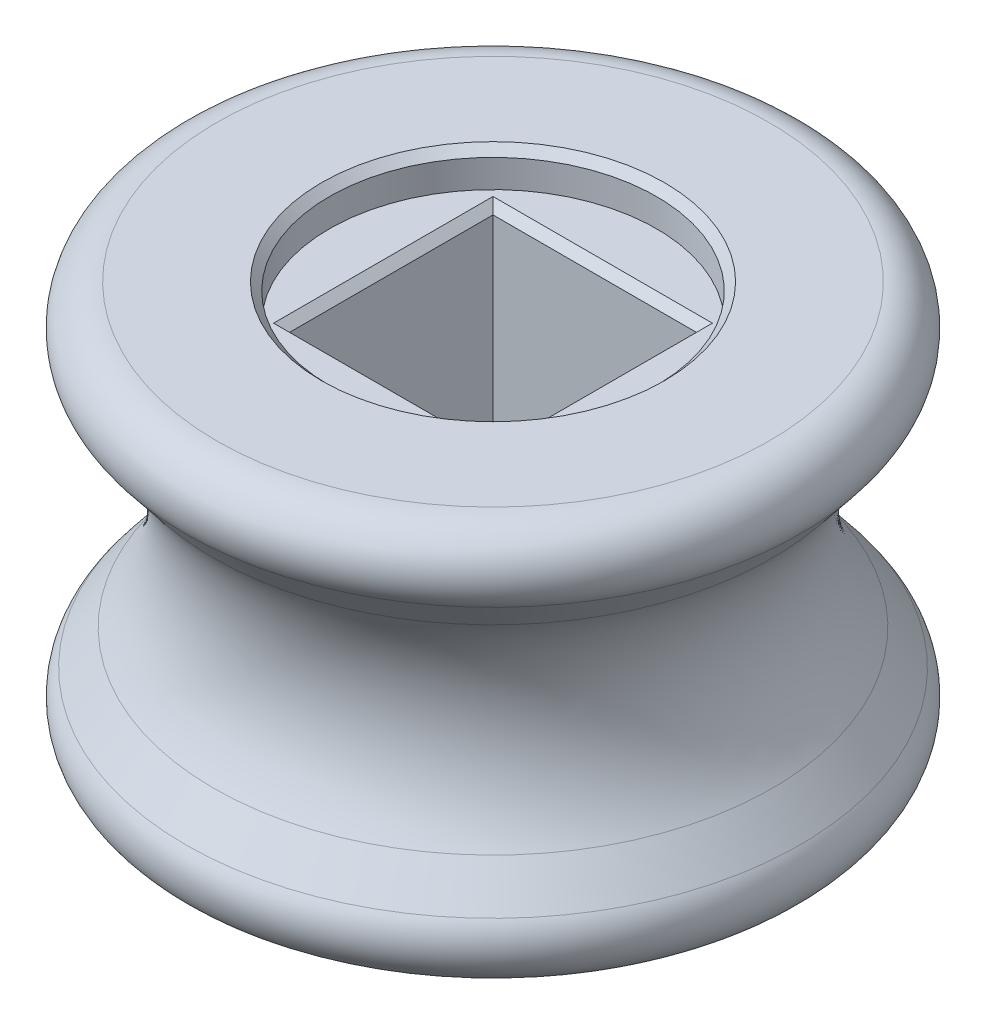
ISO-10303-21;
HEADER;
FILE_DESCRIPTION(('STEP AP214'),'2;1');
FILE_NAME('part.step','',(''),(''),'','','');
FILE_SCHEMA(('AUTOMOTIVE_DESIGN { 1 0 10303 214 1 1 1 1 }'));
ENDSEC;
DATA;
#1=APPLICATION_CONTEXT('core data for automotive mechanical design processes');
#2=APPLICATION_PROTOCOL_DEFINITION('international standard','automotive_design',2000,#1);
#3=PRODUCT_CONTEXT('',#1,'mechanical');
#4=PRODUCT('Part','Part','',(#3));
#5=PRODUCT_RELATED_PRODUCT_CATEGORY('part','',(#4));
#6=PRODUCT_DEFINITION_FORMATION('','',#4);
#7=PRODUCT_DEFINITION_CONTEXT('part definition',#1,'design');
#8=PRODUCT_DEFINITION('design','',#6,#7);
#9=PRODUCT_DEFINITION_SHAPE('','',#8);
#10=(LENGTH_UNIT() NAMED_UNIT(*) SI_UNIT(.MILLI.,.METRE.));
#11=(NAMED_UNIT(*) PLANE_ANGLE_UNIT() SI_UNIT($,.RADIAN.));
#12=(NAMED_UNIT(*) SI_UNIT($,.STERADIAN.) SOLID_ANGLE_UNIT());
#13=UNCERTAINTY_MEASURE_WITH_UNIT(LENGTH_MEASURE(1.E-05),#10,'distance_accuracy_value','');
#14=(GEOMETRIC_REPRESENTATION_CONTEXT(3) GLOBAL_UNCERTAINTY_ASSIGNED_CONTEXT((#13)) GLOBAL_UNIT_ASSIGNED_CONTEXT((#10,
#11,#12)) REPRESENTATION_CONTEXT('',''));
#15=CARTESIAN_POINT('',(0.,0.,0.));
#16=DIRECTION('',(0.,0.,1.));
#17=DIRECTION('',(1.,0.,0.));
#18=AXIS2_PLACEMENT_3D('',#15,#16,#17);
#19=CARTESIAN_POINT('',(-3.2385,26.1703841816037,3.2385));
#20=DIRECTION('',(0.,0.,-1.));
#21=DIRECTION('',(-1.,0.,0.));
#22=AXIS2_PLACEMENT_3D('',#19,#20,#21);
#23=PLANE('',#22);
#24=DIRECTION('',(0.,-1.,0.));
#25=VECTOR('',#24,1.);
#26=CARTESIAN_POINT('',(3.2385,26.1703841816037,3.2385));
#27=LINE('',#26,#25);
#28=CARTESIAN_POINT('',(3.2385,11.303,3.2385));
#29=VERTEX_POINT('',#28);
#30=CARTESIAN_POINT('',(3.2385,1.397,3.2385));
#31=VERTEX_POINT('',#30);
#32=EDGE_CURVE('E139',#29,#31,#27,.T.);
#33=ORIENTED_EDGE('',*,*,#32,.T.);
#34=DIRECTION('',(-1.,0.,0.));
#35=VECTOR('',#34,1.);
#36=CARTESIAN_POINT('',(-3.2385,1.397,3.2385));
#37=LINE('',#36,#35);
#38=CARTESIAN_POINT('',(-3.2385,1.397,3.2385));
#39=VERTEX_POINT('',#38);
#40=EDGE_CURVE('E145',#31,#39,#37,.T.);
#41=ORIENTED_EDGE('',*,*,#40,.T.);
#42=DIRECTION('',(0.,-1.,0.));
#43=VECTOR('',#42,1.);
#44=CARTESIAN_POINT('',(-3.2385,26.1703841816037,3.2385));
#45=LINE('',#44,#43);
#46=CARTESIAN_POINT('',(-3.2385,11.303,3.2385));
#47=VERTEX_POINT('',#46);
#48=EDGE_CURVE('E142',#47,#39,#45,.T.);
#49=ORIENTED_EDGE('',*,*,#48,.F.);
#50=DIRECTION('',(1.,0.,0.));
#51=VECTOR('',#50,1.);
#52=CARTESIAN_POINT('',(-3.2385,11.303,3.2385));
#53=LINE('',#52,#51);
#54=EDGE_CURVE('E117',#47,#29,#53,.T.);
#55=ORIENTED_EDGE('',*,*,#54,.T.);
#56=EDGE_LOOP('',(#33,#41,#49,#55));
#57=FACE_BOUND('',#56,.T.);
#58=ADVANCED_FACE('F44',(#57),#23,.T.);
#59=CARTESIAN_POINT('',(-3.2385,26.1703841816037,3.2385));
#60=DIRECTION('',(1.,0.,0.));
#61=DIRECTION('',(0.,0.,-1.));
#62=AXIS2_PLACEMENT_3D('',#59,#60,#61);
#63=PLANE('',#62);
#64=ORIENTED_EDGE('',*,*,#48,.T.);
#65=DIRECTION('',(0.,0.,-1.));
#66=VECTOR('',#65,1.);
#67=CARTESIAN_POINT('',(-3.2385,1.397,3.2385));
#68=LINE('',#67,#66);
#69=CARTESIAN_POINT('',(-3.2385,1.397,-3.2385));
#70=VERTEX_POINT('',#69);
#71=EDGE_CURVE('E209',#39,#70,#68,.T.);
#72=ORIENTED_EDGE('',*,*,#71,.T.);
#73=DIRECTION('',(0.,-1.,0.));
#74=VECTOR('',#73,1.);
#75=CARTESIAN_POINT('',(-3.2385,26.1703841816037,-3.2385));
#76=LINE('',#75,#74);
#77=CARTESIAN_POINT('',(-3.2385,11.303,-3.2385));
#78=VERTEX_POINT('',#77);
#79=EDGE_CURVE('E155',#78,#70,#76,.T.);
#80=ORIENTED_EDGE('',*,*,#79,.F.);
#81=DIRECTION('',(0.,0.,1.));
#82=VECTOR('',#81,1.);
#83=CARTESIAN_POINT('',(-3.2385,11.303,3.2385));
#84=LINE('',#83,#82);
#85=EDGE_CURVE('E206',#78,#47,#84,.T.);
#86=ORIENTED_EDGE('',*,*,#85,.T.);
#87=EDGE_LOOP('',(#64,#72,#80,#86));
#88=FACE_BOUND('',#87,.T.);
#89=ADVANCED_FACE('F270',(#88),#63,.T.);
#90=CARTESIAN_POINT('',(-3.2385,26.1703841816037,-3.2385));
#91=DIRECTION('',(0.,0.,1.));
#92=DIRECTION('',(1.,0.,0.));
#93=AXIS2_PLACEMENT_3D('',#90,#91,#92);
#94=PLANE('',#93);
#95=ORIENTED_EDGE('',*,*,#79,.T.);
#96=DIRECTION('',(1.,0.,0.));
#97=VECTOR('',#96,1.);
#98=CARTESIAN_POINT('',(-3.2385,1.397,-3.2385));
#99=LINE('',#98,#97);
#100=CARTESIAN_POINT('',(3.2385,1.397,-3.2385));
#101=VERTEX_POINT('',#100);
#102=EDGE_CURVE('E133',#70,#101,#99,.T.);
#103=ORIENTED_EDGE('',*,*,#102,.T.);
#104=DIRECTION('',(0.,-1.,0.));
#105=VECTOR('',#104,1.);
#106=CARTESIAN_POINT('',(3.2385,26.1703841816037,-3.2385));
#107=LINE('',#106,#105);
#108=CARTESIAN_POINT('',(3.2385,11.303,-3.2385));
#109=VERTEX_POINT('',#108);
#110=EDGE_CURVE('E165',#109,#101,#107,.T.);
#111=ORIENTED_EDGE('',*,*,#110,.F.);
#112=DIRECTION('',(-1.,0.,0.));
#113=VECTOR('',#112,1.);
#114=CARTESIAN_POINT('',(-3.2385,11.303,-3.2385));
#115=LINE('',#114,#113);
#116=EDGE_CURVE('E212',#109,#78,#115,.T.);
#117=ORIENTED_EDGE('',*,*,#116,.T.);
#118=EDGE_LOOP('',(#95,#103,#111,#117));
#119=FACE_BOUND('',#118,.T.);
#120=ADVANCED_FACE('F267',(#119),#94,.T.);
#121=CARTESIAN_POINT('',(3.2385,26.1703841816037,3.2385));
#122=DIRECTION('',(-1.,0.,0.));
#123=DIRECTION('',(0.,0.,1.));
#124=AXIS2_PLACEMENT_3D('',#121,#122,#123);
#125=PLANE('',#124);
#126=ORIENTED_EDGE('',*,*,#110,.T.);
#127=DIRECTION('',(0.,0.,1.));
#128=VECTOR('',#127,1.);
#129=CARTESIAN_POINT('',(3.2385,1.397,3.2385));
#130=LINE('',#129,#128);
#131=EDGE_CURVE('E132',#101,#31,#130,.T.);
#132=ORIENTED_EDGE('',*,*,#131,.T.);
#133=ORIENTED_EDGE('',*,*,#32,.F.);
#134=DIRECTION('',(0.,0.,-1.));
#135=VECTOR('',#134,1.);
#136=CARTESIAN_POINT('',(3.2385,11.303,3.2385));
#137=LINE('',#136,#135);
#138=EDGE_CURVE('E124',#29,#109,#137,.T.);
#139=ORIENTED_EDGE('',*,*,#138,.T.);
#140=EDGE_LOOP('',(#126,#132,#133,#139));
#141=FACE_BOUND('',#140,.T.);
#142=ADVANCED_FACE('F148',(#141),#125,.T.);
#143=CARTESIAN_POINT('',(11.43,0.,0.));
#144=DIRECTION('',(0.,-1.,0.));
#145=DIRECTION('',(0.,0.,-1.));
#146=AXIS2_PLACEMENT_3D('',#143,#144,#145);
#147=PLANE('',#146);
#148=CARTESIAN_POINT('',(0.,0.,0.));
#149=DIRECTION('',(0.,-1.,0.));
#150=DIRECTION('',(0.,0.,-1.));
#151=AXIS2_PLACEMENT_3D('',#148,#149,#150);
#152=CIRCLE('',#151,5.46099999999999);
#153=CARTESIAN_POINT('',(0.,0.,-5.46099999999999));
#154=VERTEX_POINT('',#153);
#155=EDGE_CURVE('E228',#154,#154,#152,.F.);
#156=ORIENTED_EDGE('',*,*,#155,.T.);
#157=EDGE_LOOP('',(#156));
#158=FACE_BOUND('',#157,.T.);
#159=CARTESIAN_POINT('',(0.,0.,0.));
#160=DIRECTION('',(0.,-1.,0.));
#161=DIRECTION('',(0.,0.,-1.));
#162=AXIS2_PLACEMENT_3D('',#159,#160,#161);
#163=CIRCLE('',#162,8.78760644369206);
#164=CARTESIAN_POINT('',(0.,0.,-8.78760644369206));
#165=VERTEX_POINT('',#164);
#166=EDGE_CURVE('E176',#165,#165,#163,.T.);
#167=ORIENTED_EDGE('',*,*,#166,.T.);
#168=EDGE_LOOP('',(#167));
#169=FACE_BOUND('',#168,.T.);
#170=ADVANCED_FACE('F314',(#158,#169),#147,.T.);
#171=CARTESIAN_POINT('',(4.7625,12.7,0.));
#172=DIRECTION('',(0.,1.,0.));
#173=DIRECTION('',(0.,0.,1.));
#174=AXIS2_PLACEMENT_3D('',#171,#172,#173);
#175=PLANE('',#174);
#176=CARTESIAN_POINT('',(0.,12.7,0.));
#177=DIRECTION('',(0.,1.,0.));
#178=DIRECTION('',(0.,0.,1.));
#179=AXIS2_PLACEMENT_3D('',#176,#177,#178);
#180=CIRCLE('',#179,5.461);
#181=CARTESIAN_POINT('',(0.,12.7,5.461));
#182=VERTEX_POINT('',#181);
#183=EDGE_CURVE('E11',#182,#182,#180,.F.);
#184=ORIENTED_EDGE('',*,*,#183,.T.);
#185=EDGE_LOOP('',(#184));
#186=FACE_BOUND('',#185,.T.);
#187=CARTESIAN_POINT('',(0.,12.7,0.));
#188=DIRECTION('',(0.,1.,0.));
#189=DIRECTION('',(0.,0.,1.));
#190=AXIS2_PLACEMENT_3D('',#187,#188,#189);
#191=CIRCLE('',#190,8.78760644369206);
#192=CARTESIAN_POINT('',(0.,12.7,8.78760644369206));
#193=VERTEX_POINT('',#192);
#194=EDGE_CURVE('E146',#193,#193,#191,.T.);
#195=ORIENTED_EDGE('',*,*,#194,.T.);
#196=EDGE_LOOP('',(#195));
#197=FACE_BOUND('',#196,.T.);
#198=ADVANCED_FACE('F323',(#186,#197),#175,.T.);
#199=CARTESIAN_POINT('',(0.,6.35,0.));
#200=DIRECTION('',(0.,1.,0.));
#201=DIRECTION('',(0.,0.,1.));
#202=AXIS2_PLACEMENT_3D('',#199,#200,#201);
#203=CONICAL_SURFACE('',#202,6.35,0.674740942223553);
#204=CARTESIAN_POINT('',(0.,10.6366372896059,0.));
#205=DIRECTION('',(0.,-1.,0.));
#206=DIRECTION('',(0.,0.,-1.));
#207=AXIS2_PLACEMENT_3D('',#204,#205,#206);
#208=CIRCLE('',#207,9.7793098316847);
#209=CARTESIAN_POINT('',(0.,10.6366372896059,-9.7793098316847));
#210=VERTEX_POINT('',#209);
#211=EDGE_CURVE('E184',#210,#210,#208,.T.);
#212=ORIENTED_EDGE('',*,*,#211,.T.);
#213=EDGE_LOOP('',(#212));
#214=FACE_BOUND('',#213,.T.);
#215=CARTESIAN_POINT('',(0.,9.52345084157647,0.));
#216=DIRECTION('',(0.,1.,0.));
#217=DIRECTION('',(0.,0.,1.));
#218=AXIS2_PLACEMENT_3D('',#215,#216,#217);
#219=CIRCLE('',#218,8.88876067326118);
#220=CARTESIAN_POINT('',(0.,9.52345084157647,8.88876067326118));
#221=VERTEX_POINT('',#220);
#222=EDGE_CURVE('E172',#221,#221,#219,.T.);
#223=ORIENTED_EDGE('',*,*,#222,.T.);
#224=EDGE_LOOP('',(#223));
#225=FACE_BOUND('',#224,.T.);
#226=ADVANCED_FACE('F319',(#214,#225),#203,.T.);
#227=CARTESIAN_POINT('',(0.,0.,0.));
#228=DIRECTION('',(0.,-1.,0.));
#229=DIRECTION('',(0.,0.,-1.));
#230=AXIS2_PLACEMENT_3D('',#227,#228,#229);
#231=CONICAL_SURFACE('',#230,11.43,0.674740942223553);
#232=CARTESIAN_POINT('',(0.,2.06336271039412,0.));
#233=DIRECTION('',(0.,1.,0.));
#234=DIRECTION('',(0.,0.,1.));
#235=AXIS2_PLACEMENT_3D('',#232,#233,#234);
#236=CIRCLE('',#235,9.77930983168471);
#237=CARTESIAN_POINT('',(0.,2.06336271039412,9.77930983168471));
#238=VERTEX_POINT('',#237);
#239=EDGE_CURVE('E180',#238,#238,#236,.T.);
#240=ORIENTED_EDGE('',*,*,#239,.T.);
#241=EDGE_LOOP('',(#240));
#242=FACE_BOUND('',#241,.T.);
#243=CARTESIAN_POINT('',(0.,3.17654915842353,0.));
#244=DIRECTION('',(0.,-1.,0.));
#245=DIRECTION('',(0.,0.,-1.));
#246=AXIS2_PLACEMENT_3D('',#243,#244,#245);
#247=CIRCLE('',#246,8.88876067326118);
#248=CARTESIAN_POINT('',(0.,3.17654915842353,-8.88876067326118));
#249=VERTEX_POINT('',#248);
#250=EDGE_CURVE('E168',#249,#249,#247,.T.);
#251=ORIENTED_EDGE('',*,*,#250,.T.);
#252=EDGE_LOOP('',(#251));
#253=FACE_BOUND('',#252,.T.);
#254=ADVANCED_FACE('F315',(#242,#253),#231,.T.);
#255=CARTESIAN_POINT('',(0.,6.35,0.));
#256=DIRECTION('',(0.,-1.,0.));
#257=DIRECTION('',(0.,0.,-1.));
#258=AXIS2_PLACEMENT_3D('',#255,#256,#257);
#259=TOROIDAL_SURFACE('',#258,12.8555742252318,5.08);
#260=ORIENTED_EDGE('',*,*,#222,.F.);
#261=EDGE_LOOP('',(#260));
#262=FACE_BOUND('',#261,.T.);
#263=ORIENTED_EDGE('',*,*,#250,.F.);
#264=EDGE_LOOP('',(#263));
#265=FACE_BOUND('',#264,.T.);
#266=ADVANCED_FACE('F318',(#262,#265),#259,.F.);
#267=CARTESIAN_POINT('',(0.,1.27,0.));
#268=DIRECTION('',(0.,-1.,0.));
#269=DIRECTION('',(0.,0.,-1.));
#270=AXIS2_PLACEMENT_3D('',#267,#268,#269);
#271=TOROIDAL_SURFACE('',#270,8.78760644369206,1.27);
#272=ORIENTED_EDGE('',*,*,#239,.F.);
#273=EDGE_LOOP('',(#272));
#274=FACE_BOUND('',#273,.T.);
#275=ORIENTED_EDGE('',*,*,#166,.F.);
#276=EDGE_LOOP('',(#275));
#277=FACE_BOUND('',#276,.T.);
#278=ADVANCED_FACE('F333',(#274,#277),#271,.T.);
#279=CARTESIAN_POINT('',(0.,11.43,0.));
#280=DIRECTION('',(0.,1.,0.));
#281=DIRECTION('',(0.,0.,1.));
#282=AXIS2_PLACEMENT_3D('',#279,#280,#281);
#283=TOROIDAL_SURFACE('',#282,8.78760644369206,1.27);
#284=ORIENTED_EDGE('',*,*,#194,.F.);
#285=EDGE_LOOP('',(#284));
#286=FACE_BOUND('',#285,.T.);
#287=ORIENTED_EDGE('',*,*,#211,.F.);
#288=EDGE_LOOP('',(#287));
#289=FACE_BOUND('',#288,.T.);
#290=ADVANCED_FACE('F337',(#286,#289),#283,.T.);
#291=CARTESIAN_POINT('',(0.,11.557,0.));
#292=DIRECTION('',(0.,1.,0.));
#293=DIRECTION('',(0.,0.,1.));
#294=AXIS2_PLACEMENT_3D('',#291,#292,#293);
#295=CYLINDRICAL_SURFACE('',#294,5.207);
#296=CARTESIAN_POINT('',(0.,12.446,0.));
#297=DIRECTION('',(0.,1.,0.));
#298=DIRECTION('',(0.,0.,1.));
#299=AXIS2_PLACEMENT_3D('',#296,#297,#298);
#300=CIRCLE('',#299,5.207);
#301=CARTESIAN_POINT('',(0.,12.446,5.207));
#302=VERTEX_POINT('',#301);
#303=EDGE_CURVE('E55',#302,#302,#300,.T.);
#304=ORIENTED_EDGE('',*,*,#303,.T.);
#305=EDGE_LOOP('',(#304));
#306=FACE_BOUND('',#305,.T.);
#307=CARTESIAN_POINT('',(0.,11.557,0.));
#308=DIRECTION('',(0.,1.,0.));
#309=DIRECTION('',(0.,0.,1.));
#310=AXIS2_PLACEMENT_3D('',#307,#308,#309);
#311=CIRCLE('',#310,5.207);
#312=CARTESIAN_POINT('',(0.,11.557,5.207));
#313=VERTEX_POINT('',#312);
#314=EDGE_CURVE('E151',#313,#313,#311,.T.);
#315=ORIENTED_EDGE('',*,*,#314,.F.);
#316=EDGE_LOOP('',(#315));
#317=FACE_BOUND('',#316,.T.);
#318=ADVANCED_FACE('F307',(#306,#317),#295,.F.);
#319=CARTESIAN_POINT('',(0.,11.557,0.));
#320=DIRECTION('',(0.,1.,0.));
#321=DIRECTION('',(0.,0.,1.));
#322=AXIS2_PLACEMENT_3D('',#319,#320,#321);
#323=PLANE('',#322);
#324=DIRECTION('',(0.,0.,1.));
#325=VECTOR('',#324,1.);
#326=CARTESIAN_POINT('',(3.4925,11.557,0.));
#327=LINE('',#326,#325);
#328=CARTESIAN_POINT('',(3.4925,11.557,-3.4925));
#329=VERTEX_POINT('',#328);
#330=CARTESIAN_POINT('',(3.4925,11.557,3.4925));
#331=VERTEX_POINT('',#330);
#332=EDGE_CURVE('E63',#329,#331,#327,.T.);
#333=ORIENTED_EDGE('',*,*,#332,.T.);
#334=DIRECTION('',(-1.,0.,0.));
#335=VECTOR('',#334,1.);
#336=CARTESIAN_POINT('',(0.,11.557,3.4925));
#337=LINE('',#336,#335);
#338=CARTESIAN_POINT('',(-3.4925,11.557,3.4925));
#339=VERTEX_POINT('',#338);
#340=EDGE_CURVE('E118',#331,#339,#337,.T.);
#341=ORIENTED_EDGE('',*,*,#340,.T.);
#342=DIRECTION('',(0.,0.,-1.));
#343=VECTOR('',#342,1.);
#344=CARTESIAN_POINT('',(-3.4925,11.557,0.));
#345=LINE('',#344,#343);
#346=CARTESIAN_POINT('',(-3.4925,11.557,-3.4925));
#347=VERTEX_POINT('',#346);
#348=EDGE_CURVE('E219',#339,#347,#345,.T.);
#349=ORIENTED_EDGE('',*,*,#348,.T.);
#350=DIRECTION('',(1.,0.,0.));
#351=VECTOR('',#350,1.);
#352=CARTESIAN_POINT('',(0.,11.557,-3.4925));
#353=LINE('',#352,#351);
#354=EDGE_CURVE('E68',#347,#329,#353,.T.);
#355=ORIENTED_EDGE('',*,*,#354,.T.);
#356=EDGE_LOOP('',(#333,#341,#349,#355));
#357=FACE_BOUND('',#356,.T.);
#358=ORIENTED_EDGE('',*,*,#314,.T.);
#359=EDGE_LOOP('',(#358));
#360=FACE_BOUND('',#359,.T.);
#361=ADVANCED_FACE('F394',(#357,#360),#323,.T.);
#362=CARTESIAN_POINT('',(0.,1.143,0.));
#363=DIRECTION('',(0.,-1.,0.));
#364=DIRECTION('',(0.,0.,-1.));
#365=AXIS2_PLACEMENT_3D('',#362,#363,#364);
#366=CYLINDRICAL_SURFACE('',#365,5.207);
#367=CARTESIAN_POINT('',(0.,0.253999999999993,0.));
#368=DIRECTION('',(0.,-1.,0.));
#369=DIRECTION('',(0.,0.,-1.));
#370=AXIS2_PLACEMENT_3D('',#367,#368,#369);
#371=CIRCLE('',#370,5.207);
#372=CARTESIAN_POINT('',(0.,0.253999999999993,-5.207));
#373=VERTEX_POINT('',#372);
#374=EDGE_CURVE('E232',#373,#373,#371,.T.);
#375=ORIENTED_EDGE('',*,*,#374,.T.);
#376=EDGE_LOOP('',(#375));
#377=FACE_BOUND('',#376,.T.);
#378=CARTESIAN_POINT('',(0.,1.143,0.));
#379=DIRECTION('',(0.,1.,0.));
#380=DIRECTION('',(0.,0.,1.));
#381=AXIS2_PLACEMENT_3D('',#378,#379,#380);
#382=CIRCLE('',#381,5.207);
#383=CARTESIAN_POINT('',(0.,1.143,5.207));
#384=VERTEX_POINT('',#383);
#385=EDGE_CURVE('E158',#384,#384,#382,.T.);
#386=ORIENTED_EDGE('',*,*,#385,.T.);
#387=EDGE_LOOP('',(#386));
#388=FACE_BOUND('',#387,.T.);
#389=ADVANCED_FACE('F391',(#377,#388),#366,.F.);
#390=CARTESIAN_POINT('',(0.,1.143,0.));
#391=DIRECTION('',(0.,-1.,0.));
#392=DIRECTION('',(0.,0.,1.));
#393=AXIS2_PLACEMENT_3D('',#390,#391,#392);
#394=PLANE('',#393);
#395=DIRECTION('',(0.,0.,1.));
#396=VECTOR('',#395,1.);
#397=CARTESIAN_POINT('',(-3.4925,1.143,0.));
#398=LINE('',#397,#396);
#399=CARTESIAN_POINT('',(-3.4925,1.143,-3.4925));
#400=VERTEX_POINT('',#399);
#401=CARTESIAN_POINT('',(-3.4925,1.143,3.4925));
#402=VERTEX_POINT('',#401);
#403=EDGE_CURVE('E199',#400,#402,#398,.T.);
#404=ORIENTED_EDGE('',*,*,#403,.T.);
#405=DIRECTION('',(1.,0.,0.));
#406=VECTOR('',#405,1.);
#407=CARTESIAN_POINT('',(0.,1.143,3.4925));
#408=LINE('',#407,#406);
#409=CARTESIAN_POINT('',(3.4925,1.143,3.4925));
#410=VERTEX_POINT('',#409);
#411=EDGE_CURVE('E202',#402,#410,#408,.T.);
#412=ORIENTED_EDGE('',*,*,#411,.T.);
#413=DIRECTION('',(0.,0.,-1.));
#414=VECTOR('',#413,1.);
#415=CARTESIAN_POINT('',(3.4925,1.143,0.));
#416=LINE('',#415,#414);
#417=CARTESIAN_POINT('',(3.4925,1.143,-3.4925));
#418=VERTEX_POINT('',#417);
#419=EDGE_CURVE('E193',#410,#418,#416,.T.);
#420=ORIENTED_EDGE('',*,*,#419,.T.);
#421=DIRECTION('',(-1.,0.,0.));
#422=VECTOR('',#421,1.);
#423=CARTESIAN_POINT('',(0.,1.143,-3.4925));
#424=LINE('',#423,#422);
#425=EDGE_CURVE('E196',#418,#400,#424,.T.);
#426=ORIENTED_EDGE('',*,*,#425,.T.);
#427=EDGE_LOOP('',(#404,#412,#420,#426));
#428=FACE_BOUND('',#427,.T.);
#429=ORIENTED_EDGE('',*,*,#385,.F.);
#430=EDGE_LOOP('',(#429));
#431=FACE_BOUND('',#430,.T.);
#432=ADVANCED_FACE('F283',(#428,#431),#394,.T.);
#433=CARTESIAN_POINT('',(-3.2385,1.397,-3.2385));
#434=DIRECTION('',(0.,0.707106781186547,-0.707106781186547));
#435=DIRECTION('',(1.,0.,0.));
#436=AXIS2_PLACEMENT_3D('',#433,#434,#435);
#437=PLANE('',#436);
#438=DIRECTION('',(-0.577350269189626,-0.577350269189626,-0.577350269189626));
#439=VECTOR('',#438,1.);
#440=CARTESIAN_POINT('',(-1.0795,3.556,-1.0795));
#441=LINE('',#440,#439);
#442=EDGE_CURVE('E245',#400,#70,#441,.F.);
#443=ORIENTED_EDGE('',*,*,#442,.F.);
#444=ORIENTED_EDGE('',*,*,#425,.F.);
#445=DIRECTION('',(0.577350269189626,-0.577350269189626,-0.577350269189626));
#446=VECTOR('',#445,1.);
#447=CARTESIAN_POINT('',(1.0795,3.556,-1.0795));
#448=LINE('',#447,#446);
#449=EDGE_CURVE('E249',#101,#418,#448,.T.);
#450=ORIENTED_EDGE('',*,*,#449,.F.);
#451=ORIENTED_EDGE('',*,*,#102,.F.);
#452=EDGE_LOOP('',(#443,#444,#450,#451));
#453=FACE_BOUND('',#452,.T.);
#454=ADVANCED_FACE('F288',(#453),#437,.F.);
#455=CARTESIAN_POINT('',(3.2385,1.397,3.2385));
#456=DIRECTION('',(0.707106781186547,0.707106781186547,0.));
#457=DIRECTION('',(0.,0.,1.));
#458=AXIS2_PLACEMENT_3D('',#455,#456,#457);
#459=PLANE('',#458);
#460=ORIENTED_EDGE('',*,*,#449,.T.);
#461=ORIENTED_EDGE('',*,*,#419,.F.);
#462=DIRECTION('',(-0.577350269189626,0.577350269189626,-0.577350269189626));
#463=VECTOR('',#462,1.);
#464=CARTESIAN_POINT('',(1.0795,3.556,1.0795));
#465=LINE('',#464,#463);
#466=EDGE_CURVE('E242',#31,#410,#465,.F.);
#467=ORIENTED_EDGE('',*,*,#466,.F.);
#468=ORIENTED_EDGE('',*,*,#131,.F.);
#469=EDGE_LOOP('',(#460,#461,#467,#468));
#470=FACE_BOUND('',#469,.T.);
#471=ADVANCED_FACE('F290',(#470),#459,.F.);
#472=CARTESIAN_POINT('',(-3.2385,1.397,3.2385));
#473=DIRECTION('',(-0.707106781186547,0.707106781186547,0.));
#474=DIRECTION('',(0.,0.,-1.));
#475=AXIS2_PLACEMENT_3D('',#472,#473,#474);
#476=PLANE('',#475);
#477=ORIENTED_EDGE('',*,*,#442,.T.);
#478=ORIENTED_EDGE('',*,*,#71,.F.);
#479=DIRECTION('',(-0.577350269189626,-0.577350269189626,0.577350269189626));
#480=VECTOR('',#479,1.);
#481=CARTESIAN_POINT('',(-3.2385,1.397,3.2385));
#482=LINE('',#481,#480);
#483=EDGE_CURVE('E239',#402,#39,#482,.F.);
#484=ORIENTED_EDGE('',*,*,#483,.F.);
#485=ORIENTED_EDGE('',*,*,#403,.F.);
#486=EDGE_LOOP('',(#477,#478,#484,#485));
#487=FACE_BOUND('',#486,.T.);
#488=ADVANCED_FACE('F274',(#487),#476,.F.);
#489=CARTESIAN_POINT('',(-3.2385,1.397,3.2385));
#490=DIRECTION('',(0.,0.707106781186547,0.707106781186547));
#491=DIRECTION('',(-1.,0.,0.));
#492=AXIS2_PLACEMENT_3D('',#489,#490,#491);
#493=PLANE('',#492);
#494=ORIENTED_EDGE('',*,*,#466,.T.);
#495=ORIENTED_EDGE('',*,*,#411,.F.);
#496=ORIENTED_EDGE('',*,*,#483,.T.);
#497=ORIENTED_EDGE('',*,*,#40,.F.);
#498=EDGE_LOOP('',(#494,#495,#496,#497));
#499=FACE_BOUND('',#498,.T.);
#500=ADVANCED_FACE('F279',(#499),#493,.F.);
#501=CARTESIAN_POINT('',(-3.2385,11.303,-3.2385));
#502=DIRECTION('',(0.,-0.707106781186552,-0.707106781186543));
#503=DIRECTION('',(-1.,0.,0.));
#504=AXIS2_PLACEMENT_3D('',#501,#502,#503);
#505=PLANE('',#504);
#506=DIRECTION('',(0.577350269189628,0.577350269189621,-0.577350269189628));
#507=VECTOR('',#506,1.);
#508=CARTESIAN_POINT('',(1.07949999999998,9.14400000000001,-1.07949999999998));
#509=LINE('',#508,#507);
#510=EDGE_CURVE('E126',#329,#109,#509,.F.);
#511=ORIENTED_EDGE('',*,*,#510,.F.);
#512=ORIENTED_EDGE('',*,*,#354,.F.);
#513=DIRECTION('',(-0.577350269189628,0.577350269189621,-0.577350269189628));
#514=VECTOR('',#513,1.);
#515=CARTESIAN_POINT('',(-3.2385,11.303,-3.2385));
#516=LINE('',#515,#514);
#517=EDGE_CURVE('E49',#78,#347,#516,.T.);
#518=ORIENTED_EDGE('',*,*,#517,.F.);
#519=ORIENTED_EDGE('',*,*,#116,.F.);
#520=EDGE_LOOP('',(#511,#512,#518,#519));
#521=FACE_BOUND('',#520,.T.);
#522=ADVANCED_FACE('F264',(#521),#505,.F.);
#523=CARTESIAN_POINT('',(-3.2385,11.303,3.2385));
#524=DIRECTION('',(-0.707106781186543,-0.707106781186552,0.));
#525=DIRECTION('',(0.,0.,1.));
#526=AXIS2_PLACEMENT_3D('',#523,#524,#525);
#527=PLANE('',#526);
#528=ORIENTED_EDGE('',*,*,#517,.T.);
#529=ORIENTED_EDGE('',*,*,#348,.F.);
#530=DIRECTION('',(0.577350269189628,-0.577350269189621,-0.577350269189628));
#531=VECTOR('',#530,1.);
#532=CARTESIAN_POINT('',(-3.2385,11.303,3.2385));
#533=LINE('',#532,#531);
#534=EDGE_CURVE('E121',#47,#339,#533,.F.);
#535=ORIENTED_EDGE('',*,*,#534,.F.);
#536=ORIENTED_EDGE('',*,*,#85,.F.);
#537=EDGE_LOOP('',(#528,#529,#535,#536));
#538=FACE_BOUND('',#537,.T.);
#539=ADVANCED_FACE('F261',(#538),#527,.F.);
#540=CARTESIAN_POINT('',(3.2385,11.303,3.2385));
#541=DIRECTION('',(0.707106781186543,-0.707106781186552,0.));
#542=DIRECTION('',(0.,0.,-1.));
#543=AXIS2_PLACEMENT_3D('',#540,#541,#542);
#544=PLANE('',#543);
#545=ORIENTED_EDGE('',*,*,#510,.T.);
#546=ORIENTED_EDGE('',*,*,#138,.F.);
#547=DIRECTION('',(0.577350269189628,0.577350269189621,0.577350269189628));
#548=VECTOR('',#547,1.);
#549=CARTESIAN_POINT('',(1.07949999999998,9.14400000000001,1.07949999999998));
#550=LINE('',#549,#548);
#551=EDGE_CURVE('E113',#331,#29,#550,.F.);
#552=ORIENTED_EDGE('',*,*,#551,.F.);
#553=ORIENTED_EDGE('',*,*,#332,.F.);
#554=EDGE_LOOP('',(#545,#546,#552,#553));
#555=FACE_BOUND('',#554,.T.);
#556=ADVANCED_FACE('F125',(#555),#544,.F.);
#557=CARTESIAN_POINT('',(-3.2385,11.303,3.2385));
#558=DIRECTION('',(0.,-0.707106781186552,0.707106781186543));
#559=DIRECTION('',(1.,0.,0.));
#560=AXIS2_PLACEMENT_3D('',#557,#558,#559);
#561=PLANE('',#560);
#562=ORIENTED_EDGE('',*,*,#534,.T.);
#563=ORIENTED_EDGE('',*,*,#340,.F.);
#564=ORIENTED_EDGE('',*,*,#551,.T.);
#565=ORIENTED_EDGE('',*,*,#54,.F.);
#566=EDGE_LOOP('',(#562,#563,#564,#565));
#567=FACE_BOUND('',#566,.T.);
#568=ADVANCED_FACE('F115',(#567),#561,.F.);
#569=CARTESIAN_POINT('',(0.,0.,0.));
#570=DIRECTION('',(0.,-1.,0.));
#571=DIRECTION('',(0.,0.,-1.));
#572=AXIS2_PLACEMENT_3D('',#569,#570,#571);
#573=CONICAL_SURFACE('',#572,5.46099999999999,0.785398163397448);
#574=ORIENTED_EDGE('',*,*,#374,.F.);
#575=EDGE_LOOP('',(#574));
#576=FACE_BOUND('',#575,.T.);
#577=ORIENTED_EDGE('',*,*,#155,.F.);
#578=EDGE_LOOP('',(#577));
#579=FACE_BOUND('',#578,.T.);
#580=ADVANCED_FACE('F363',(#576,#579),#573,.F.);
#581=CARTESIAN_POINT('',(0.,12.446,0.));
#582=DIRECTION('',(0.,1.,0.));
#583=DIRECTION('',(0.,0.,1.));
#584=AXIS2_PLACEMENT_3D('',#581,#582,#583);
#585=CONICAL_SURFACE('',#584,5.207,0.785398163397455);
#586=ORIENTED_EDGE('',*,*,#183,.F.);
#587=EDGE_LOOP('',(#586));
#588=FACE_BOUND('',#587,.T.);
#589=ORIENTED_EDGE('',*,*,#303,.F.);
#590=EDGE_LOOP('',(#589));
#591=FACE_BOUND('',#590,.T.);
#592=ADVANCED_FACE('F47',(#588,#591),#585,.F.);
#593=CLOSED_SHELL('',(#58,#89,#120,#142,#170,#198,#226,#254,#266,#278,#290,#318,#361,#389,#432,
#454,#471,#488,#500,#522,#539,#556,#568,#580,#592));
#594=MANIFOLD_SOLID_BREP('B2',#593);
#595=ADVANCED_BREP_SHAPE_REPRESENTATION('',(#18,#594),#14);
#596=SHAPE_DEFINITION_REPRESENTATION(#9,#595);
ENDSEC;
END-ISO-10303-21;
